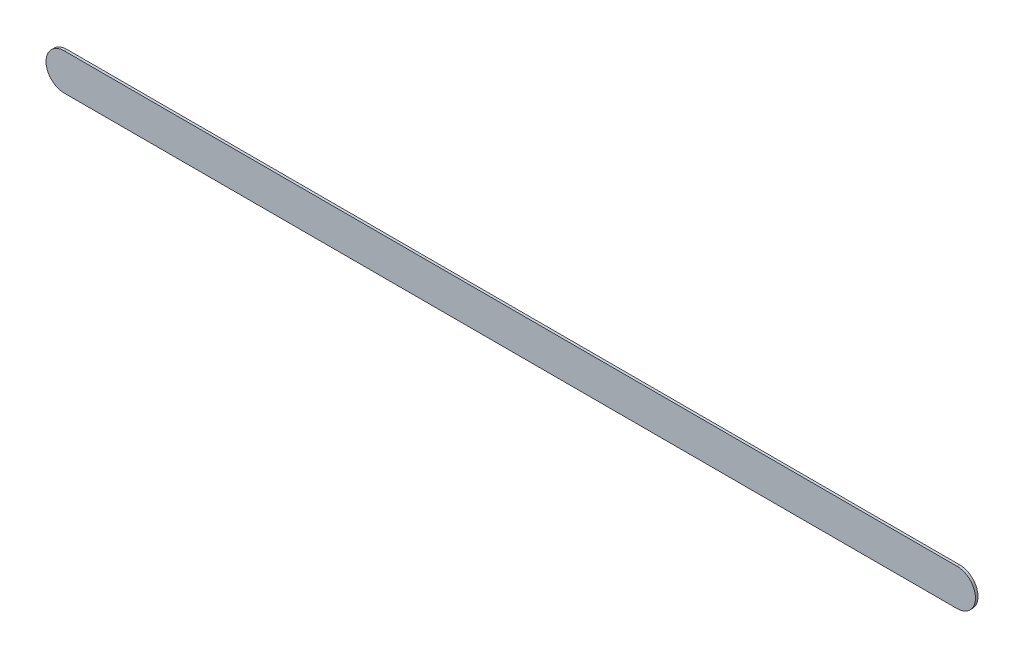
ISO-10303-21;
HEADER;
FILE_DESCRIPTION(('STEP AP214'),'2;1');
FILE_NAME('part.step','',(''),(''),'','','');
FILE_SCHEMA(('AUTOMOTIVE_DESIGN { 1 0 10303 214 1 1 1 1 }'));
ENDSEC;
DATA;
#1=APPLICATION_CONTEXT('core data for automotive mechanical design processes');
#2=APPLICATION_PROTOCOL_DEFINITION('international standard','automotive_design',2000,#1);
#3=PRODUCT_CONTEXT('',#1,'mechanical');
#4=PRODUCT('Part','Part','',(#3));
#5=PRODUCT_RELATED_PRODUCT_CATEGORY('part','',(#4));
#6=PRODUCT_DEFINITION_FORMATION('','',#4);
#7=PRODUCT_DEFINITION_CONTEXT('part definition',#1,'design');
#8=PRODUCT_DEFINITION('design','',#6,#7);
#9=PRODUCT_DEFINITION_SHAPE('','',#8);
#10=(LENGTH_UNIT() NAMED_UNIT(*) SI_UNIT(.MILLI.,.METRE.));
#11=(NAMED_UNIT(*) PLANE_ANGLE_UNIT() SI_UNIT($,.RADIAN.));
#12=(NAMED_UNIT(*) SI_UNIT($,.STERADIAN.) SOLID_ANGLE_UNIT());
#13=UNCERTAINTY_MEASURE_WITH_UNIT(LENGTH_MEASURE(1.E-05),#10,'distance_accuracy_value','');
#14=(GEOMETRIC_REPRESENTATION_CONTEXT(3) GLOBAL_UNCERTAINTY_ASSIGNED_CONTEXT((#13)) GLOBAL_UNIT_ASSIGNED_CONTEXT((#10,
#11,#12)) REPRESENTATION_CONTEXT('',''));
#15=CARTESIAN_POINT('',(0.,0.,0.));
#16=DIRECTION('',(0.,0.,1.));
#17=DIRECTION('',(1.,0.,0.));
#18=AXIS2_PLACEMENT_3D('',#15,#16,#17);
#19=CARTESIAN_POINT('',(148.05,-56.63,1.635));
#20=DIRECTION('',(0.,0.,1.));
#21=DIRECTION('',(1.,0.,0.));
#22=AXIS2_PLACEMENT_3D('',#19,#20,#21);
#23=PLANE('',#22);
#24=DIRECTION('',(1.,0.,0.));
#25=VECTOR('',#24,1.);
#26=CARTESIAN_POINT('',(148.05,-56.63,1.635));
#27=LINE('',#26,#25);
#28=CARTESIAN_POINT('',(148.05,-56.63,1.635));
#29=VERTEX_POINT('',#28);
#30=CARTESIAN_POINT('',(160.23,-56.63,1.635));
#31=VERTEX_POINT('',#30);
#32=EDGE_CURVE('E85',#29,#31,#27,.T.);
#33=ORIENTED_EDGE('',*,*,#32,.T.);
#34=CARTESIAN_POINT('',(160.23,-56.38,1.635));
#35=DIRECTION('',(0.,0.,1.));
#36=DIRECTION('',(0.,-1.,0.));
#37=AXIS2_PLACEMENT_3D('',#34,#35,#36);
#38=CIRCLE('',#37,0.25);
#39=CARTESIAN_POINT('',(160.23,-56.13,1.635));
#40=VERTEX_POINT('',#39);
#41=EDGE_CURVE('E71',#31,#40,#38,.T.);
#42=ORIENTED_EDGE('',*,*,#41,.T.);
#43=DIRECTION('',(-1.,0.,0.));
#44=VECTOR('',#43,1.);
#45=CARTESIAN_POINT('',(160.23,-56.13,1.635));
#46=LINE('',#45,#44);
#47=CARTESIAN_POINT('',(148.05,-56.13,1.635));
#48=VERTEX_POINT('',#47);
#49=EDGE_CURVE('E104',#40,#48,#46,.T.);
#50=ORIENTED_EDGE('',*,*,#49,.T.);
#51=CARTESIAN_POINT('',(148.05,-56.38,1.635));
#52=DIRECTION('',(0.,0.,1.));
#53=DIRECTION('',(0.,1.,0.));
#54=AXIS2_PLACEMENT_3D('',#51,#52,#53);
#55=CIRCLE('',#54,0.25);
#56=EDGE_CURVE('E11',#48,#29,#55,.T.);
#57=ORIENTED_EDGE('',*,*,#56,.T.);
#58=EDGE_LOOP('',(#33,#42,#50,#57));
#59=FACE_BOUND('',#58,.T.);
#60=ADVANCED_FACE('F17',(#59),#23,.T.);
#61=CARTESIAN_POINT('',(148.05,-56.63,1.6));
#62=DIRECTION('',(0.,0.,1.));
#63=DIRECTION('',(1.,0.,0.));
#64=AXIS2_PLACEMENT_3D('',#61,#62,#63);
#65=PLANE('',#64);
#66=CARTESIAN_POINT('',(148.05,-56.38,1.6));
#67=DIRECTION('',(0.,0.,1.));
#68=DIRECTION('',(0.,1.,0.));
#69=AXIS2_PLACEMENT_3D('',#66,#67,#68);
#70=CIRCLE('',#69,0.25);
#71=CARTESIAN_POINT('',(148.05,-56.13,1.6));
#72=VERTEX_POINT('',#71);
#73=CARTESIAN_POINT('',(148.05,-56.63,1.6));
#74=VERTEX_POINT('',#73);
#75=EDGE_CURVE('E20',#72,#74,#70,.T.);
#76=ORIENTED_EDGE('',*,*,#75,.F.);
#77=DIRECTION('',(-1.,0.,0.));
#78=VECTOR('',#77,1.);
#79=CARTESIAN_POINT('',(160.23,-56.13,1.6));
#80=LINE('',#79,#78);
#81=CARTESIAN_POINT('',(160.23,-56.13,1.6));
#82=VERTEX_POINT('',#81);
#83=EDGE_CURVE('E82',#82,#72,#80,.T.);
#84=ORIENTED_EDGE('',*,*,#83,.F.);
#85=CARTESIAN_POINT('',(160.23,-56.38,1.6));
#86=DIRECTION('',(0.,0.,1.));
#87=DIRECTION('',(0.,-1.,0.));
#88=AXIS2_PLACEMENT_3D('',#85,#86,#87);
#89=CIRCLE('',#88,0.25);
#90=CARTESIAN_POINT('',(160.23,-56.63,1.6));
#91=VERTEX_POINT('',#90);
#92=EDGE_CURVE('E103',#91,#82,#89,.T.);
#93=ORIENTED_EDGE('',*,*,#92,.F.);
#94=DIRECTION('',(1.,0.,0.));
#95=VECTOR('',#94,1.);
#96=CARTESIAN_POINT('',(148.05,-56.63,1.6));
#97=LINE('',#96,#95);
#98=EDGE_CURVE('E92',#74,#91,#97,.T.);
#99=ORIENTED_EDGE('',*,*,#98,.F.);
#100=EDGE_LOOP('',(#76,#84,#93,#99));
#101=FACE_BOUND('',#100,.T.);
#102=ADVANCED_FACE('F124',(#101),#65,.F.);
#103=CARTESIAN_POINT('',(148.05,-56.38,1.6));
#104=DIRECTION('',(0.,0.,-1.));
#105=DIRECTION('',(0.,1.,0.));
#106=AXIS2_PLACEMENT_3D('',#103,#104,#105);
#107=CYLINDRICAL_SURFACE('',#106,0.25);
#108=ORIENTED_EDGE('',*,*,#75,.T.);
#109=DIRECTION('',(0.,0.,1.));
#110=VECTOR('',#109,1.);
#111=CARTESIAN_POINT('',(148.05,-56.63,1.6));
#112=LINE('',#111,#110);
#113=EDGE_CURVE('E89',#74,#29,#112,.T.);
#114=ORIENTED_EDGE('',*,*,#113,.T.);
#115=ORIENTED_EDGE('',*,*,#56,.F.);
#116=DIRECTION('',(0.,0.,1.));
#117=VECTOR('',#116,1.);
#118=CARTESIAN_POINT('',(148.05,-56.13,1.6));
#119=LINE('',#118,#117);
#120=EDGE_CURVE('E107',#72,#48,#119,.T.);
#121=ORIENTED_EDGE('',*,*,#120,.F.);
#122=EDGE_LOOP('',(#108,#114,#115,#121));
#123=FACE_BOUND('',#122,.T.);
#124=ADVANCED_FACE('F122',(#123),#107,.T.);
#125=CARTESIAN_POINT('',(160.23,-56.13,1.6));
#126=DIRECTION('',(0.,-1.,0.));
#127=DIRECTION('',(0.,0.,-1.));
#128=AXIS2_PLACEMENT_3D('',#125,#126,#127);
#129=PLANE('',#128);
#130=ORIENTED_EDGE('',*,*,#83,.T.);
#131=ORIENTED_EDGE('',*,*,#120,.T.);
#132=ORIENTED_EDGE('',*,*,#49,.F.);
#133=DIRECTION('',(0.,0.,1.));
#134=VECTOR('',#133,1.);
#135=CARTESIAN_POINT('',(160.23,-56.13,1.6));
#136=LINE('',#135,#134);
#137=EDGE_CURVE('E79',#82,#40,#136,.T.);
#138=ORIENTED_EDGE('',*,*,#137,.F.);
#139=EDGE_LOOP('',(#130,#131,#132,#138));
#140=FACE_BOUND('',#139,.T.);
#141=ADVANCED_FACE('F121',(#140),#129,.F.);
#142=CARTESIAN_POINT('',(160.23,-56.38,1.6));
#143=DIRECTION('',(0.,0.,-1.));
#144=DIRECTION('',(0.,-1.,0.));
#145=AXIS2_PLACEMENT_3D('',#142,#143,#144);
#146=CYLINDRICAL_SURFACE('',#145,0.25);
#147=ORIENTED_EDGE('',*,*,#92,.T.);
#148=ORIENTED_EDGE('',*,*,#137,.T.);
#149=ORIENTED_EDGE('',*,*,#41,.F.);
#150=DIRECTION('',(0.,0.,1.));
#151=VECTOR('',#150,1.);
#152=CARTESIAN_POINT('',(160.23,-56.63,1.6));
#153=LINE('',#152,#151);
#154=EDGE_CURVE('E76',#91,#31,#153,.T.);
#155=ORIENTED_EDGE('',*,*,#154,.F.);
#156=EDGE_LOOP('',(#147,#148,#149,#155));
#157=FACE_BOUND('',#156,.T.);
#158=ADVANCED_FACE('F74',(#157),#146,.T.);
#159=CARTESIAN_POINT('',(148.05,-56.63,1.6));
#160=DIRECTION('',(0.,1.,0.));
#161=DIRECTION('',(1.,0.,0.));
#162=AXIS2_PLACEMENT_3D('',#159,#160,#161);
#163=PLANE('',#162);
#164=ORIENTED_EDGE('',*,*,#98,.T.);
#165=ORIENTED_EDGE('',*,*,#154,.T.);
#166=ORIENTED_EDGE('',*,*,#32,.F.);
#167=ORIENTED_EDGE('',*,*,#113,.F.);
#168=EDGE_LOOP('',(#164,#165,#166,#167));
#169=FACE_BOUND('',#168,.T.);
#170=ADVANCED_FACE('F91',(#169),#163,.F.);
#171=CLOSED_SHELL('',(#60,#102,#124,#141,#158,#170));
#172=MANIFOLD_SOLID_BREP('B1',#171);
#173=ADVANCED_BREP_SHAPE_REPRESENTATION('',(#18,#172),#14);
#174=SHAPE_DEFINITION_REPRESENTATION(#9,#173);
ENDSEC;
END-ISO-10303-21;
